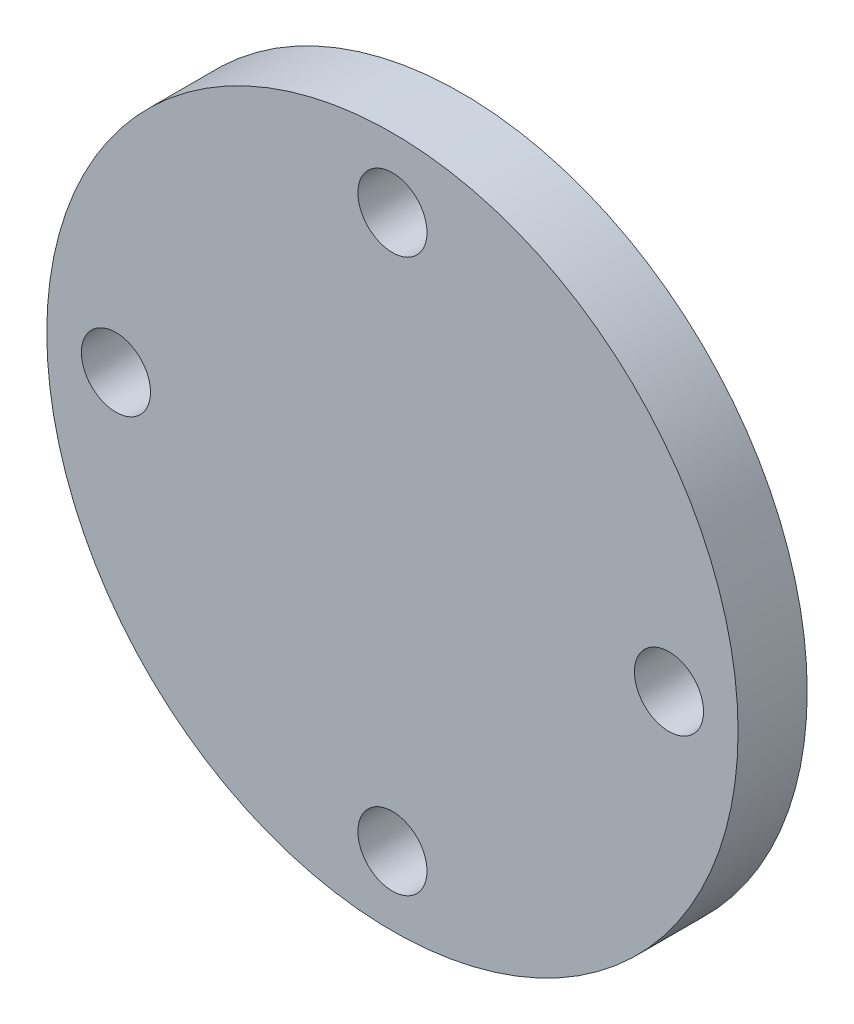
ISO-10303-21;
HEADER;
FILE_DESCRIPTION(('STEP AP214'),'2;1');
FILE_NAME('part.step','',(''),(''),'','','');
FILE_SCHEMA(('AUTOMOTIVE_DESIGN { 1 0 10303 214 1 1 1 1 }'));
ENDSEC;
DATA;
#1=APPLICATION_CONTEXT('core data for automotive mechanical design processes');
#2=APPLICATION_PROTOCOL_DEFINITION('international standard','automotive_design',2000,#1);
#3=PRODUCT_CONTEXT('',#1,'mechanical');
#4=PRODUCT('Part','Part','',(#3));
#5=PRODUCT_RELATED_PRODUCT_CATEGORY('part','',(#4));
#6=PRODUCT_DEFINITION_FORMATION('','',#4);
#7=PRODUCT_DEFINITION_CONTEXT('part definition',#1,'design');
#8=PRODUCT_DEFINITION('design','',#6,#7);
#9=PRODUCT_DEFINITION_SHAPE('','',#8);
#10=(LENGTH_UNIT() NAMED_UNIT(*) SI_UNIT(.MILLI.,.METRE.));
#11=(NAMED_UNIT(*) PLANE_ANGLE_UNIT() SI_UNIT($,.RADIAN.));
#12=(NAMED_UNIT(*) SI_UNIT($,.STERADIAN.) SOLID_ANGLE_UNIT());
#13=UNCERTAINTY_MEASURE_WITH_UNIT(LENGTH_MEASURE(1.E-05),#10,'distance_accuracy_value','');
#14=(GEOMETRIC_REPRESENTATION_CONTEXT(3) GLOBAL_UNCERTAINTY_ASSIGNED_CONTEXT((#13)) GLOBAL_UNIT_ASSIGNED_CONTEXT((#10,
#11,#12)) REPRESENTATION_CONTEXT('',''));
#15=CARTESIAN_POINT('',(0.,0.,0.));
#16=DIRECTION('',(0.,0.,1.));
#17=DIRECTION('',(1.,0.,0.));
#18=AXIS2_PLACEMENT_3D('',#15,#16,#17);
#19=CARTESIAN_POINT('',(0.,0.,20.));
#20=DIRECTION('',(0.,0.,-1.));
#21=DIRECTION('',(-1.,0.,0.));
#22=AXIS2_PLACEMENT_3D('',#19,#20,#21);
#23=CYLINDRICAL_SURFACE('',#22,100.);
#24=CARTESIAN_POINT('',(0.,0.,20.));
#25=DIRECTION('',(0.,0.,1.));
#26=DIRECTION('',(1.,0.,0.));
#27=AXIS2_PLACEMENT_3D('',#24,#25,#26);
#28=CIRCLE('',#27,100.);
#29=CARTESIAN_POINT('',(100.,0.,20.));
#30=VERTEX_POINT('',#29);
#31=EDGE_CURVE('E10',#30,#30,#28,.T.);
#32=ORIENTED_EDGE('',*,*,#31,.F.);
#33=EDGE_LOOP('',(#32));
#34=FACE_BOUND('',#33,.T.);
#35=CARTESIAN_POINT('',(0.,0.,0.));
#36=DIRECTION('',(0.,0.,1.));
#37=DIRECTION('',(1.,0.,0.));
#38=AXIS2_PLACEMENT_3D('',#35,#36,#37);
#39=CIRCLE('',#38,100.);
#40=CARTESIAN_POINT('',(100.,0.,0.));
#41=VERTEX_POINT('',#40);
#42=EDGE_CURVE('E37',#41,#41,#39,.T.);
#43=ORIENTED_EDGE('',*,*,#42,.T.);
#44=EDGE_LOOP('',(#43));
#45=FACE_BOUND('',#44,.T.);
#46=ADVANCED_FACE('F40',(#34,#45),#23,.T.);
#47=CARTESIAN_POINT('',(0.,0.,20.));
#48=DIRECTION('',(0.,0.,1.));
#49=DIRECTION('',(1.,0.,0.));
#50=AXIS2_PLACEMENT_3D('',#47,#48,#49);
#51=PLANE('',#50);
#52=CARTESIAN_POINT('',(80.,0.,20.));
#53=DIRECTION('',(0.,0.,1.));
#54=DIRECTION('',(1.,0.,0.));
#55=AXIS2_PLACEMENT_3D('',#52,#53,#54);
#56=CIRCLE('',#55,10.);
#57=CARTESIAN_POINT('',(90.,0.,20.));
#58=VERTEX_POINT('',#57);
#59=EDGE_CURVE('E66',#58,#58,#56,.T.);
#60=ORIENTED_EDGE('',*,*,#59,.F.);
#61=EDGE_LOOP('',(#60));
#62=FACE_BOUND('',#61,.T.);
#63=CARTESIAN_POINT('',(0.,80.,20.));
#64=DIRECTION('',(0.,0.,1.));
#65=DIRECTION('',(1.,0.,0.));
#66=AXIS2_PLACEMENT_3D('',#63,#64,#65);
#67=CIRCLE('',#66,10.);
#68=CARTESIAN_POINT('',(9.99999999999999,80.,20.));
#69=VERTEX_POINT('',#68);
#70=EDGE_CURVE('E65',#69,#69,#67,.T.);
#71=ORIENTED_EDGE('',*,*,#70,.F.);
#72=EDGE_LOOP('',(#71));
#73=FACE_BOUND('',#72,.T.);
#74=CARTESIAN_POINT('',(0.,-80.,20.));
#75=DIRECTION('',(0.,0.,1.));
#76=DIRECTION('',(1.,0.,0.));
#77=AXIS2_PLACEMENT_3D('',#74,#75,#76);
#78=CIRCLE('',#77,10.);
#79=CARTESIAN_POINT('',(9.99999999999999,-80.,20.));
#80=VERTEX_POINT('',#79);
#81=EDGE_CURVE('E60',#80,#80,#78,.T.);
#82=ORIENTED_EDGE('',*,*,#81,.F.);
#83=EDGE_LOOP('',(#82));
#84=FACE_BOUND('',#83,.T.);
#85=CARTESIAN_POINT('',(-80.,0.,20.));
#86=DIRECTION('',(0.,0.,1.));
#87=DIRECTION('',(1.,0.,0.));
#88=AXIS2_PLACEMENT_3D('',#85,#86,#87);
#89=CIRCLE('',#88,10.);
#90=CARTESIAN_POINT('',(-70.,0.,20.));
#91=VERTEX_POINT('',#90);
#92=EDGE_CURVE('E51',#91,#91,#89,.T.);
#93=ORIENTED_EDGE('',*,*,#92,.F.);
#94=EDGE_LOOP('',(#93));
#95=FACE_BOUND('',#94,.T.);
#96=ORIENTED_EDGE('',*,*,#31,.T.);
#97=EDGE_LOOP('',(#96));
#98=FACE_BOUND('',#97,.T.);
#99=ADVANCED_FACE('F95',(#62,#73,#84,#95,#98),#51,.T.);
#100=CARTESIAN_POINT('',(0.,0.,0.));
#101=DIRECTION('',(0.,0.,1.));
#102=DIRECTION('',(1.,0.,0.));
#103=AXIS2_PLACEMENT_3D('',#100,#101,#102);
#104=PLANE('',#103);
#105=CARTESIAN_POINT('',(0.,0.,0.));
#106=DIRECTION('',(0.,0.,-1.));
#107=DIRECTION('',(-1.,0.,0.));
#108=AXIS2_PLACEMENT_3D('',#105,#106,#107);
#109=CIRCLE('',#108,10.);
#110=CARTESIAN_POINT('',(-10.,0.,0.));
#111=VERTEX_POINT('',#110);
#112=EDGE_CURVE('E71',#111,#111,#109,.T.);
#113=ORIENTED_EDGE('',*,*,#112,.F.);
#114=EDGE_LOOP('',(#113));
#115=FACE_BOUND('',#114,.T.);
#116=ORIENTED_EDGE('',*,*,#42,.F.);
#117=EDGE_LOOP('',(#116));
#118=FACE_BOUND('',#117,.T.);
#119=ADVANCED_FACE('F86',(#115,#118),#104,.F.);
#120=CARTESIAN_POINT('',(-80.,0.,2.));
#121=DIRECTION('',(0.,0.,-1.));
#122=DIRECTION('',(-1.,0.,0.));
#123=AXIS2_PLACEMENT_3D('',#120,#121,#122);
#124=PLANE('',#123);
#125=CARTESIAN_POINT('',(-80.,0.,2.));
#126=DIRECTION('',(0.,0.,1.));
#127=DIRECTION('',(1.,0.,0.));
#128=AXIS2_PLACEMENT_3D('',#125,#126,#127);
#129=CIRCLE('',#128,10.);
#130=CARTESIAN_POINT('',(-70.,0.,2.));
#131=VERTEX_POINT('',#130);
#132=EDGE_CURVE('E50',#131,#131,#129,.T.);
#133=ORIENTED_EDGE('',*,*,#132,.T.);
#134=EDGE_LOOP('',(#133));
#135=FACE_BOUND('',#134,.T.);
#136=ADVANCED_FACE('F93',(#135),#124,.F.);
#137=CARTESIAN_POINT('',(-80.,0.,20.));
#138=DIRECTION('',(0.,0.,1.));
#139=DIRECTION('',(1.,0.,0.));
#140=AXIS2_PLACEMENT_3D('',#137,#138,#139);
#141=CYLINDRICAL_SURFACE('',#140,10.);
#142=ORIENTED_EDGE('',*,*,#132,.F.);
#143=EDGE_LOOP('',(#142));
#144=FACE_BOUND('',#143,.T.);
#145=ORIENTED_EDGE('',*,*,#92,.T.);
#146=EDGE_LOOP('',(#145));
#147=FACE_BOUND('',#146,.T.);
#148=ADVANCED_FACE('F108',(#144,#147),#141,.F.);
#149=CARTESIAN_POINT('',(0.,-80.,2.));
#150=DIRECTION('',(0.,0.,-1.));
#151=DIRECTION('',(-1.,0.,0.));
#152=AXIS2_PLACEMENT_3D('',#149,#150,#151);
#153=PLANE('',#152);
#154=CARTESIAN_POINT('',(0.,-80.,2.));
#155=DIRECTION('',(0.,0.,1.));
#156=DIRECTION('',(1.,0.,0.));
#157=AXIS2_PLACEMENT_3D('',#154,#155,#156);
#158=CIRCLE('',#157,10.);
#159=CARTESIAN_POINT('',(10.,-80.,2.));
#160=VERTEX_POINT('',#159);
#161=EDGE_CURVE('E53',#160,#160,#158,.T.);
#162=ORIENTED_EDGE('',*,*,#161,.T.);
#163=EDGE_LOOP('',(#162));
#164=FACE_BOUND('',#163,.T.);
#165=ADVANCED_FACE('F114',(#164),#153,.F.);
#166=CARTESIAN_POINT('',(0.,-80.,20.));
#167=DIRECTION('',(0.,0.,1.));
#168=DIRECTION('',(1.,0.,0.));
#169=AXIS2_PLACEMENT_3D('',#166,#167,#168);
#170=CYLINDRICAL_SURFACE('',#169,10.);
#171=ORIENTED_EDGE('',*,*,#161,.F.);
#172=EDGE_LOOP('',(#171));
#173=FACE_BOUND('',#172,.T.);
#174=ORIENTED_EDGE('',*,*,#81,.T.);
#175=EDGE_LOOP('',(#174));
#176=FACE_BOUND('',#175,.T.);
#177=ADVANCED_FACE('F116',(#173,#176),#170,.F.);
#178=CARTESIAN_POINT('',(0.,80.,2.));
#179=DIRECTION('',(0.,0.,-1.));
#180=DIRECTION('',(-1.,0.,0.));
#181=AXIS2_PLACEMENT_3D('',#178,#179,#180);
#182=PLANE('',#181);
#183=CARTESIAN_POINT('',(0.,80.,2.));
#184=DIRECTION('',(0.,0.,1.));
#185=DIRECTION('',(1.,0.,0.));
#186=AXIS2_PLACEMENT_3D('',#183,#184,#185);
#187=CIRCLE('',#186,10.);
#188=CARTESIAN_POINT('',(10.,80.,2.));
#189=VERTEX_POINT('',#188);
#190=EDGE_CURVE('E58',#189,#189,#187,.T.);
#191=ORIENTED_EDGE('',*,*,#190,.T.);
#192=EDGE_LOOP('',(#191));
#193=FACE_BOUND('',#192,.T.);
#194=ADVANCED_FACE('F122',(#193),#182,.F.);
#195=CARTESIAN_POINT('',(0.,80.,20.));
#196=DIRECTION('',(0.,0.,1.));
#197=DIRECTION('',(1.,0.,0.));
#198=AXIS2_PLACEMENT_3D('',#195,#196,#197);
#199=CYLINDRICAL_SURFACE('',#198,10.);
#200=ORIENTED_EDGE('',*,*,#190,.F.);
#201=EDGE_LOOP('',(#200));
#202=FACE_BOUND('',#201,.T.);
#203=ORIENTED_EDGE('',*,*,#70,.T.);
#204=EDGE_LOOP('',(#203));
#205=FACE_BOUND('',#204,.T.);
#206=ADVANCED_FACE('F123',(#202,#205),#199,.F.);
#207=CARTESIAN_POINT('',(80.,0.,2.));
#208=DIRECTION('',(0.,0.,-1.));
#209=DIRECTION('',(-1.,0.,0.));
#210=AXIS2_PLACEMENT_3D('',#207,#208,#209);
#211=PLANE('',#210);
#212=CARTESIAN_POINT('',(80.,0.,2.));
#213=DIRECTION('',(0.,0.,1.));
#214=DIRECTION('',(1.,0.,0.));
#215=AXIS2_PLACEMENT_3D('',#212,#213,#214);
#216=CIRCLE('',#215,10.);
#217=CARTESIAN_POINT('',(90.,0.,2.));
#218=VERTEX_POINT('',#217);
#219=EDGE_CURVE('E67',#218,#218,#216,.T.);
#220=ORIENTED_EDGE('',*,*,#219,.T.);
#221=EDGE_LOOP('',(#220));
#222=FACE_BOUND('',#221,.T.);
#223=ADVANCED_FACE('F129',(#222),#211,.F.);
#224=CARTESIAN_POINT('',(80.,0.,20.));
#225=DIRECTION('',(0.,0.,1.));
#226=DIRECTION('',(1.,0.,0.));
#227=AXIS2_PLACEMENT_3D('',#224,#225,#226);
#228=CYLINDRICAL_SURFACE('',#227,10.);
#229=ORIENTED_EDGE('',*,*,#219,.F.);
#230=EDGE_LOOP('',(#229));
#231=FACE_BOUND('',#230,.T.);
#232=ORIENTED_EDGE('',*,*,#59,.T.);
#233=EDGE_LOOP('',(#232));
#234=FACE_BOUND('',#233,.T.);
#235=ADVANCED_FACE('F81',(#231,#234),#228,.F.);
#236=CARTESIAN_POINT('',(0.,0.,10.));
#237=DIRECTION('',(0.,0.,-1.));
#238=DIRECTION('',(-1.,0.,0.));
#239=AXIS2_PLACEMENT_3D('',#236,#237,#238);
#240=CYLINDRICAL_SURFACE('',#239,10.);
#241=CARTESIAN_POINT('',(0.,0.,10.));
#242=DIRECTION('',(0.,0.,-1.));
#243=DIRECTION('',(-1.,0.,0.));
#244=AXIS2_PLACEMENT_3D('',#241,#242,#243);
#245=CIRCLE('',#244,10.);
#246=CARTESIAN_POINT('',(-10.,0.,10.));
#247=VERTEX_POINT('',#246);
#248=EDGE_CURVE('E75',#247,#247,#245,.T.);
#249=ORIENTED_EDGE('',*,*,#248,.F.);
#250=EDGE_LOOP('',(#249));
#251=FACE_BOUND('',#250,.T.);
#252=ORIENTED_EDGE('',*,*,#112,.T.);
#253=EDGE_LOOP('',(#252));
#254=FACE_BOUND('',#253,.T.);
#255=ADVANCED_FACE('F82',(#251,#254),#240,.F.);
#256=CARTESIAN_POINT('',(0.,0.,10.));
#257=DIRECTION('',(0.,0.,-1.));
#258=DIRECTION('',(-1.,0.,0.));
#259=AXIS2_PLACEMENT_3D('',#256,#257,#258);
#260=PLANE('',#259);
#261=ORIENTED_EDGE('',*,*,#248,.T.);
#262=EDGE_LOOP('',(#261));
#263=FACE_BOUND('',#262,.T.);
#264=ADVANCED_FACE('F78',(#263),#260,.T.);
#265=CLOSED_SHELL('',(#46,#99,#119,#136,#148,#165,#177,#194,#206,#223,#235,#255,#264));
#266=MANIFOLD_SOLID_BREP('B2',#265);
#267=ADVANCED_BREP_SHAPE_REPRESENTATION('',(#18,#266),#14);
#268=SHAPE_DEFINITION_REPRESENTATION(#9,#267);
ENDSEC;
END-ISO-10303-21;
